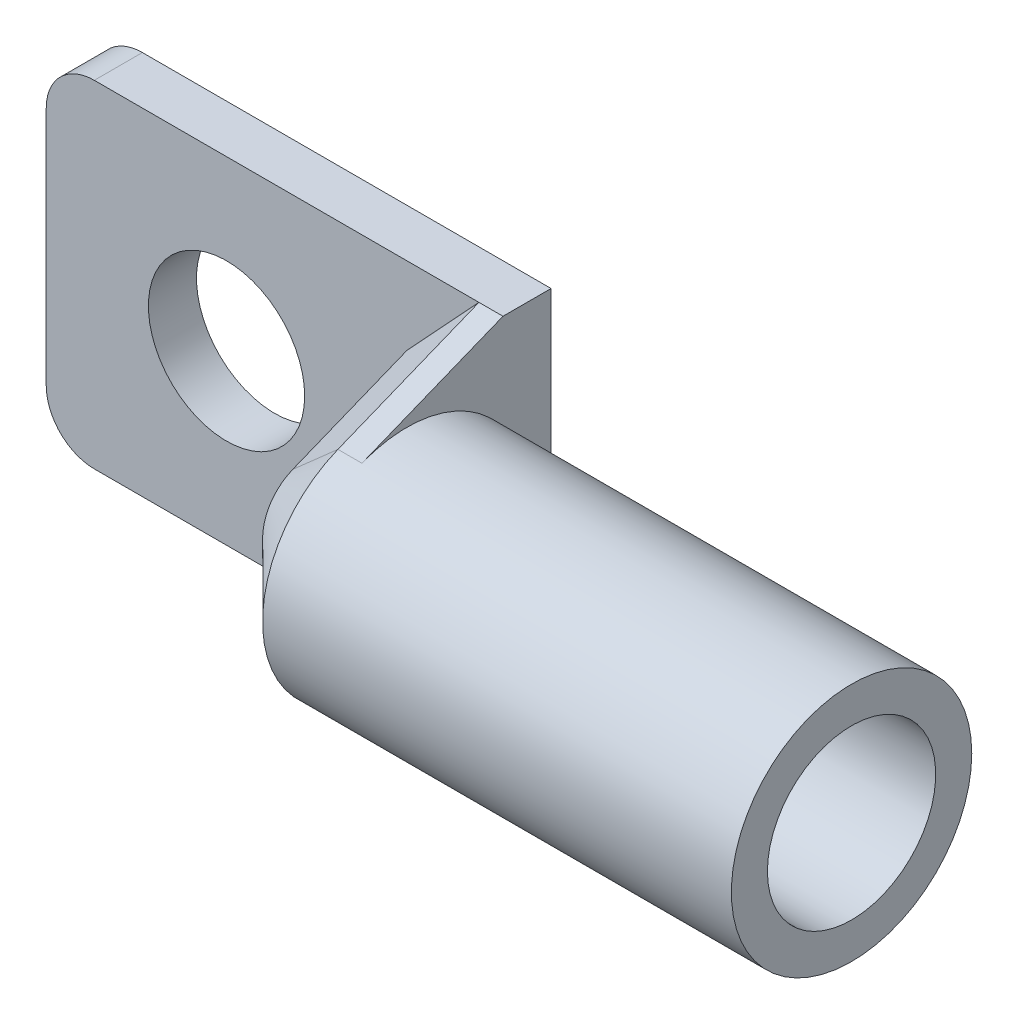
ISO-10303-21;
HEADER;
FILE_DESCRIPTION(('STEP AP214'),'2;1');
FILE_NAME('part.step','',(''),(''),'','','');
FILE_SCHEMA(('AUTOMOTIVE_DESIGN { 1 0 10303 214 1 1 1 1 }'));
ENDSEC;
DATA;
#1=APPLICATION_CONTEXT('core data for automotive mechanical design processes');
#2=APPLICATION_PROTOCOL_DEFINITION('international standard','automotive_design',2000,#1);
#3=PRODUCT_CONTEXT('',#1,'mechanical');
#4=PRODUCT('Part','Part','',(#3));
#5=PRODUCT_RELATED_PRODUCT_CATEGORY('part','',(#4));
#6=PRODUCT_DEFINITION_FORMATION('','',#4);
#7=PRODUCT_DEFINITION_CONTEXT('part definition',#1,'design');
#8=PRODUCT_DEFINITION('design','',#6,#7);
#9=PRODUCT_DEFINITION_SHAPE('','',#8);
#10=(LENGTH_UNIT() NAMED_UNIT(*) SI_UNIT(.MILLI.,.METRE.));
#11=(NAMED_UNIT(*) PLANE_ANGLE_UNIT() SI_UNIT($,.RADIAN.));
#12=(NAMED_UNIT(*) SI_UNIT($,.STERADIAN.) SOLID_ANGLE_UNIT());
#13=UNCERTAINTY_MEASURE_WITH_UNIT(LENGTH_MEASURE(1.E-05),#10,'distance_accuracy_value','');
#14=(GEOMETRIC_REPRESENTATION_CONTEXT(3) GLOBAL_UNCERTAINTY_ASSIGNED_CONTEXT((#13)) GLOBAL_UNIT_ASSIGNED_CONTEXT((#10,
#11,#12)) REPRESENTATION_CONTEXT('',''));
#15=CARTESIAN_POINT('',(0.,0.,0.));
#16=DIRECTION('',(0.,0.,1.));
#17=DIRECTION('',(1.,0.,0.));
#18=AXIS2_PLACEMENT_3D('',#15,#16,#17);
#19=CARTESIAN_POINT('',(0.,0.,2.));
#20=DIRECTION('',(0.,0.,1.));
#21=DIRECTION('',(1.,0.,0.));
#22=AXIS2_PLACEMENT_3D('',#19,#20,#21);
#23=PLANE('',#22);
#24=DIRECTION('',(0.,-1.,0.));
#25=VECTOR('',#24,1.);
#26=CARTESIAN_POINT('',(-7.5,7.,2.));
#27=LINE('',#26,#25);
#28=CARTESIAN_POINT('',(-7.5,5.,2.));
#29=VERTEX_POINT('',#28);
#30=CARTESIAN_POINT('',(-7.5,-5.,2.));
#31=VERTEX_POINT('',#30);
#32=EDGE_CURVE('E162',#29,#31,#27,.T.);
#33=ORIENTED_EDGE('',*,*,#32,.T.);
#34=CARTESIAN_POINT('',(-5.5,-5.,2.));
#35=DIRECTION('',(0.,0.,1.));
#36=DIRECTION('',(1.,0.,0.));
#37=AXIS2_PLACEMENT_3D('',#34,#35,#36);
#38=CIRCLE('',#37,2.);
#39=CARTESIAN_POINT('',(-5.5,-7.,2.));
#40=VERTEX_POINT('',#39);
#41=EDGE_CURVE('E43',#31,#40,#38,.T.);
#42=ORIENTED_EDGE('',*,*,#41,.T.);
#43=DIRECTION('',(1.,0.,0.));
#44=VECTOR('',#43,1.);
#45=CARTESIAN_POINT('',(-7.5,-7.,2.));
#46=LINE('',#45,#44);
#47=CARTESIAN_POINT('',(10.5,-7.,2.));
#48=VERTEX_POINT('',#47);
#49=EDGE_CURVE('E164',#40,#48,#46,.T.);
#50=ORIENTED_EDGE('',*,*,#49,.T.);
#51=DIRECTION('',(0.680094155203561,-0.733124777959356,0.));
#52=VECTOR('',#51,1.);
#53=CARTESIAN_POINT('',(10.5,-7.,2.));
#54=LINE('',#53,#52);
#55=CARTESIAN_POINT('',(7.5,-3.766073760449,2.));
#56=VERTEX_POINT('',#55);
#57=EDGE_CURVE('E192',#48,#56,#54,.F.);
#58=ORIENTED_EDGE('',*,*,#57,.T.);
#59=DIRECTION('',(0.,1.,0.));
#60=VECTOR('',#59,1.);
#61=CARTESIAN_POINT('',(7.5,7.,2.));
#62=LINE('',#61,#60);
#63=CARTESIAN_POINT('',(7.5,3.766073760449,2.));
#64=VERTEX_POINT('',#63);
#65=EDGE_CURVE('E167',#56,#64,#62,.T.);
#66=ORIENTED_EDGE('',*,*,#65,.T.);
#67=DIRECTION('',(-0.680094155203561,-0.733124777959356,0.));
#68=VECTOR('',#67,1.);
#69=CARTESIAN_POINT('',(9.32248316403477,5.73066580221966,2.));
#70=LINE('',#69,#68);
#71=CARTESIAN_POINT('',(10.5,7.,2.));
#72=VERTEX_POINT('',#71);
#73=EDGE_CURVE('E189',#64,#72,#70,.F.);
#74=ORIENTED_EDGE('',*,*,#73,.T.);
#75=DIRECTION('',(-1.,0.,0.));
#76=VECTOR('',#75,1.);
#77=CARTESIAN_POINT('',(-7.5,7.,2.));
#78=LINE('',#77,#76);
#79=CARTESIAN_POINT('',(-5.5,7.,2.));
#80=VERTEX_POINT('',#79);
#81=EDGE_CURVE('E170',#72,#80,#78,.T.);
#82=ORIENTED_EDGE('',*,*,#81,.T.);
#83=CARTESIAN_POINT('',(-5.5,5.,2.));
#84=DIRECTION('',(0.,0.,1.));
#85=DIRECTION('',(1.,0.,0.));
#86=AXIS2_PLACEMENT_3D('',#83,#84,#85);
#87=CIRCLE('',#86,2.);
#88=EDGE_CURVE('E211',#80,#29,#87,.T.);
#89=ORIENTED_EDGE('',*,*,#88,.T.);
#90=EDGE_LOOP('',(#33,#42,#50,#58,#66,#74,#82,#89));
#91=FACE_BOUND('',#90,.T.);
#92=CARTESIAN_POINT('',(0.,0.,2.));
#93=DIRECTION('',(0.,0.,1.));
#94=DIRECTION('',(1.,0.,0.));
#95=AXIS2_PLACEMENT_3D('',#92,#93,#94);
#96=CIRCLE('',#95,3.25);
#97=CARTESIAN_POINT('',(3.25,0.,2.));
#98=VERTEX_POINT('',#97);
#99=EDGE_CURVE('E156',#98,#98,#96,.T.);
#100=ORIENTED_EDGE('',*,*,#99,.F.);
#101=EDGE_LOOP('',(#100));
#102=FACE_BOUND('',#101,.T.);
#103=ADVANCED_FACE('F35',(#91,#102),#23,.T.);
#104=CARTESIAN_POINT('',(0.,0.,0.));
#105=DIRECTION('',(0.,0.,1.));
#106=DIRECTION('',(1.,0.,0.));
#107=AXIS2_PLACEMENT_3D('',#104,#105,#106);
#108=PLANE('',#107);
#109=DIRECTION('',(1.,0.,0.));
#110=VECTOR('',#109,1.);
#111=CARTESIAN_POINT('',(-7.5,-7.,0.));
#112=LINE('',#111,#110);
#113=CARTESIAN_POINT('',(-5.5,-7.,0.));
#114=VERTEX_POINT('',#113);
#115=CARTESIAN_POINT('',(11.5,-7.,0.));
#116=VERTEX_POINT('',#115);
#117=EDGE_CURVE('E174',#114,#116,#112,.T.);
#118=ORIENTED_EDGE('',*,*,#117,.F.);
#119=CARTESIAN_POINT('',(-5.5,-5.,0.));
#120=DIRECTION('',(0.,0.,1.));
#121=DIRECTION('',(1.,0.,0.));
#122=AXIS2_PLACEMENT_3D('',#119,#120,#121);
#123=CIRCLE('',#122,2.);
#124=CARTESIAN_POINT('',(-7.5,-5.,0.));
#125=VERTEX_POINT('',#124);
#126=EDGE_CURVE('E205',#114,#125,#123,.F.);
#127=ORIENTED_EDGE('',*,*,#126,.T.);
#128=DIRECTION('',(0.,-1.,0.));
#129=VECTOR('',#128,1.);
#130=CARTESIAN_POINT('',(-7.5,7.,0.));
#131=LINE('',#130,#129);
#132=CARTESIAN_POINT('',(-7.5,5.,0.));
#133=VERTEX_POINT('',#132);
#134=EDGE_CURVE('E159',#133,#125,#131,.T.);
#135=ORIENTED_EDGE('',*,*,#134,.F.);
#136=CARTESIAN_POINT('',(-5.5,5.,0.));
#137=DIRECTION('',(0.,0.,1.));
#138=DIRECTION('',(1.,0.,0.));
#139=AXIS2_PLACEMENT_3D('',#136,#137,#138);
#140=CIRCLE('',#139,2.);
#141=CARTESIAN_POINT('',(-5.5,7.,0.));
#142=VERTEX_POINT('',#141);
#143=EDGE_CURVE('E203',#133,#142,#140,.F.);
#144=ORIENTED_EDGE('',*,*,#143,.T.);
#145=DIRECTION('',(-1.,0.,0.));
#146=VECTOR('',#145,1.);
#147=CARTESIAN_POINT('',(-7.5,7.,0.));
#148=LINE('',#147,#146);
#149=CARTESIAN_POINT('',(11.5,7.,0.));
#150=VERTEX_POINT('',#149);
#151=EDGE_CURVE('E165',#150,#142,#148,.T.);
#152=ORIENTED_EDGE('',*,*,#151,.F.);
#153=DIRECTION('',(0.,1.,0.));
#154=VECTOR('',#153,1.);
#155=CARTESIAN_POINT('',(11.5,7.,0.));
#156=LINE('',#155,#154);
#157=EDGE_CURVE('E235',#116,#150,#156,.T.);
#158=ORIENTED_EDGE('',*,*,#157,.F.);
#159=EDGE_LOOP('',(#118,#127,#135,#144,#152,#158));
#160=FACE_BOUND('',#159,.T.);
#161=CARTESIAN_POINT('',(0.,0.,0.));
#162=DIRECTION('',(0.,0.,1.));
#163=DIRECTION('',(1.,0.,0.));
#164=AXIS2_PLACEMENT_3D('',#161,#162,#163);
#165=CIRCLE('',#164,3.25);
#166=CARTESIAN_POINT('',(3.25,0.,0.));
#167=VERTEX_POINT('',#166);
#168=EDGE_CURVE('E155',#167,#167,#165,.T.);
#169=ORIENTED_EDGE('',*,*,#168,.T.);
#170=EDGE_LOOP('',(#169));
#171=FACE_BOUND('',#170,.T.);
#172=ADVANCED_FACE('F227',(#160,#171),#108,.F.);
#173=CARTESIAN_POINT('',(-7.5,7.,2.));
#174=DIRECTION('',(1.,0.,0.));
#175=DIRECTION('',(0.,0.,-1.));
#176=AXIS2_PLACEMENT_3D('',#173,#174,#175);
#177=PLANE('',#176);
#178=ORIENTED_EDGE('',*,*,#134,.T.);
#179=DIRECTION('',(0.,0.,-1.));
#180=VECTOR('',#179,1.);
#181=CARTESIAN_POINT('',(-7.5,-5.,2.));
#182=LINE('',#181,#180);
#183=EDGE_CURVE('E56',#125,#31,#182,.F.);
#184=ORIENTED_EDGE('',*,*,#183,.T.);
#185=ORIENTED_EDGE('',*,*,#32,.F.);
#186=DIRECTION('',(0.,0.,-1.));
#187=VECTOR('',#186,1.);
#188=CARTESIAN_POINT('',(-7.5,5.,2.));
#189=LINE('',#188,#187);
#190=EDGE_CURVE('E207',#29,#133,#189,.T.);
#191=ORIENTED_EDGE('',*,*,#190,.T.);
#192=EDGE_LOOP('',(#178,#184,#185,#191));
#193=FACE_BOUND('',#192,.T.);
#194=ADVANCED_FACE('F230',(#193),#177,.F.);
#195=CARTESIAN_POINT('',(-7.5,-7.,2.));
#196=DIRECTION('',(0.,1.,0.));
#197=DIRECTION('',(0.,0.,1.));
#198=AXIS2_PLACEMENT_3D('',#195,#196,#197);
#199=PLANE('',#198);
#200=ORIENTED_EDGE('',*,*,#49,.F.);
#201=DIRECTION('',(0.,0.,-1.));
#202=VECTOR('',#201,1.);
#203=CARTESIAN_POINT('',(-5.5,-7.,2.));
#204=LINE('',#203,#202);
#205=EDGE_CURVE('E194',#40,#114,#204,.T.);
#206=ORIENTED_EDGE('',*,*,#205,.T.);
#207=ORIENTED_EDGE('',*,*,#117,.T.);
#208=DIRECTION('',(0.,0.,-1.));
#209=VECTOR('',#208,1.);
#210=CARTESIAN_POINT('',(11.5,-7.,0.));
#211=LINE('',#210,#209);
#212=CARTESIAN_POINT('',(11.5,-7.,2.));
#213=VERTEX_POINT('',#212);
#214=EDGE_CURVE('E236',#213,#116,#211,.T.);
#215=ORIENTED_EDGE('',*,*,#214,.F.);
#216=DIRECTION('',(-1.,0.,0.));
#217=VECTOR('',#216,1.);
#218=CARTESIAN_POINT('',(11.5,-7.,2.));
#219=LINE('',#218,#217);
#220=EDGE_CURVE('E148',#213,#48,#219,.T.);
#221=ORIENTED_EDGE('',*,*,#220,.T.);
#222=EDGE_LOOP('',(#200,#206,#207,#215,#221));
#223=FACE_BOUND('',#222,.T.);
#224=ADVANCED_FACE('F219',(#223),#199,.F.);
#225=CARTESIAN_POINT('',(-7.5,7.,2.));
#226=DIRECTION('',(0.,-1.,0.));
#227=DIRECTION('',(0.,0.,-1.));
#228=AXIS2_PLACEMENT_3D('',#225,#226,#227);
#229=PLANE('',#228);
#230=ORIENTED_EDGE('',*,*,#151,.T.);
#231=DIRECTION('',(0.,0.,-1.));
#232=VECTOR('',#231,1.);
#233=CARTESIAN_POINT('',(-5.5,7.,2.));
#234=LINE('',#233,#232);
#235=EDGE_CURVE('E11',#142,#80,#234,.F.);
#236=ORIENTED_EDGE('',*,*,#235,.T.);
#237=ORIENTED_EDGE('',*,*,#81,.F.);
#238=DIRECTION('',(-1.,0.,0.));
#239=VECTOR('',#238,1.);
#240=CARTESIAN_POINT('',(11.5,7.,2.));
#241=LINE('',#240,#239);
#242=CARTESIAN_POINT('',(11.5,7.,2.));
#243=VERTEX_POINT('',#242);
#244=EDGE_CURVE('E146',#243,#72,#241,.T.);
#245=ORIENTED_EDGE('',*,*,#244,.F.);
#246=DIRECTION('',(0.,0.,1.));
#247=VECTOR('',#246,1.);
#248=CARTESIAN_POINT('',(11.5,7.,2.));
#249=LINE('',#248,#247);
#250=EDGE_CURVE('E137',#150,#243,#249,.T.);
#251=ORIENTED_EDGE('',*,*,#250,.F.);
#252=EDGE_LOOP('',(#230,#236,#237,#245,#251));
#253=FACE_BOUND('',#252,.T.);
#254=ADVANCED_FACE('F234',(#253),#229,.F.);
#255=CARTESIAN_POINT('',(0.,0.,2.));
#256=DIRECTION('',(0.,0.,-1.));
#257=DIRECTION('',(-1.,0.,0.));
#258=AXIS2_PLACEMENT_3D('',#255,#256,#257);
#259=CYLINDRICAL_SURFACE('',#258,3.25);
#260=ORIENTED_EDGE('',*,*,#99,.T.);
#261=EDGE_LOOP('',(#260));
#262=FACE_BOUND('',#261,.T.);
#263=ORIENTED_EDGE('',*,*,#168,.F.);
#264=EDGE_LOOP('',(#263));
#265=FACE_BOUND('',#264,.T.);
#266=ADVANCED_FACE('F273',(#262,#265),#259,.F.);
#267=CARTESIAN_POINT('',(11.5,0.,6.));
#268=DIRECTION('',(-1.,0.,0.));
#269=DIRECTION('',(0.,0.,1.));
#270=AXIS2_PLACEMENT_3D('',#267,#268,#269);
#271=CYLINDRICAL_SURFACE('',#270,5.);
#272=DIRECTION('',(-1.,0.,0.));
#273=VECTOR('',#272,1.);
#274=CARTESIAN_POINT('',(11.5,4.63832471394977,7.8670682494121));
#275=LINE('',#274,#273);
#276=CARTESIAN_POINT('',(11.5,4.63832471394977,7.8670682494121));
#277=VERTEX_POINT('',#276);
#278=CARTESIAN_POINT('',(10.5,4.63832471394977,7.8670682494121));
#279=VERTEX_POINT('',#278);
#280=EDGE_CURVE('E124',#277,#279,#275,.T.);
#281=ORIENTED_EDGE('',*,*,#280,.T.);
#282=CARTESIAN_POINT('',(10.5,0.,6.));
#283=DIRECTION('',(1.,0.,0.));
#284=DIRECTION('',(0.,0.,-1.));
#285=AXIS2_PLACEMENT_3D('',#282,#283,#284);
#286=CIRCLE('',#285,5.);
#287=CARTESIAN_POINT('',(10.5,-4.63832471394977,7.8670682494121));
#288=VERTEX_POINT('',#287);
#289=EDGE_CURVE('E187',#279,#288,#286,.T.);
#290=ORIENTED_EDGE('',*,*,#289,.T.);
#291=DIRECTION('',(-1.,0.,0.));
#292=VECTOR('',#291,1.);
#293=CARTESIAN_POINT('',(11.5,-4.63832471394977,7.8670682494121));
#294=LINE('',#293,#292);
#295=CARTESIAN_POINT('',(11.5,-4.63832471394977,7.8670682494121));
#296=VERTEX_POINT('',#295);
#297=EDGE_CURVE('E126',#296,#288,#294,.T.);
#298=ORIENTED_EDGE('',*,*,#297,.F.);
#299=CARTESIAN_POINT('',(11.5,0.,6.));
#300=DIRECTION('',(1.,0.,0.));
#301=DIRECTION('',(0.,0.,-1.));
#302=AXIS2_PLACEMENT_3D('',#299,#300,#301);
#303=CIRCLE('',#302,5.);
#304=EDGE_CURVE('E119',#277,#296,#303,.F.);
#305=ORIENTED_EDGE('',*,*,#304,.F.);
#306=EDGE_LOOP('',(#281,#290,#298,#305));
#307=FACE_BOUND('',#306,.T.);
#308=CARTESIAN_POINT('',(30.,0.,6.));
#309=DIRECTION('',(1.,0.,0.));
#310=DIRECTION('',(0.,0.,-1.));
#311=AXIS2_PLACEMENT_3D('',#308,#309,#310);
#312=CIRCLE('',#311,5.);
#313=CARTESIAN_POINT('',(30.,0.,1.));
#314=VERTEX_POINT('',#313);
#315=EDGE_CURVE('E130',#314,#314,#312,.T.);
#316=ORIENTED_EDGE('',*,*,#315,.F.);
#317=EDGE_LOOP('',(#316));
#318=FACE_BOUND('',#317,.T.);
#319=ADVANCED_FACE('F121',(#307,#318),#271,.T.);
#320=CARTESIAN_POINT('',(11.5,-7.,2.));
#321=DIRECTION('',(0.,0.927664942789954,-0.37341364988242));
#322=DIRECTION('',(0.,0.37341364988242,0.927664942789954));
#323=AXIS2_PLACEMENT_3D('',#320,#321,#322);
#324=PLANE('',#323);
#325=ORIENTED_EDGE('',*,*,#297,.T.);
#326=DIRECTION('',(0.,-0.37341364988242,-0.927664942789954));
#327=VECTOR('',#326,1.);
#328=CARTESIAN_POINT('',(10.5,-7.,2.));
#329=LINE('',#328,#327);
#330=EDGE_CURVE('E184',#288,#48,#329,.T.);
#331=ORIENTED_EDGE('',*,*,#330,.T.);
#332=ORIENTED_EDGE('',*,*,#220,.F.);
#333=DIRECTION('',(0.,-0.37341364988242,-0.927664942789954));
#334=VECTOR('',#333,1.);
#335=CARTESIAN_POINT('',(11.5,-7.,2.));
#336=LINE('',#335,#334);
#337=EDGE_CURVE('E129',#296,#213,#336,.T.);
#338=ORIENTED_EDGE('',*,*,#337,.F.);
#339=EDGE_LOOP('',(#325,#331,#332,#338));
#340=FACE_BOUND('',#339,.T.);
#341=ADVANCED_FACE('F374',(#340),#324,.F.);
#342=CARTESIAN_POINT('',(11.5,4.63832471394977,7.8670682494121));
#343=DIRECTION('',(0.,-0.927664942789954,-0.37341364988242));
#344=DIRECTION('',(0.,0.37341364988242,-0.927664942789954));
#345=AXIS2_PLACEMENT_3D('',#342,#343,#344);
#346=PLANE('',#345);
#347=ORIENTED_EDGE('',*,*,#244,.T.);
#348=DIRECTION('',(0.,-0.37341364988242,0.927664942789954));
#349=VECTOR('',#348,1.);
#350=CARTESIAN_POINT('',(10.5,4.63832471394977,7.8670682494121));
#351=LINE('',#350,#349);
#352=EDGE_CURVE('E145',#72,#279,#351,.T.);
#353=ORIENTED_EDGE('',*,*,#352,.T.);
#354=ORIENTED_EDGE('',*,*,#280,.F.);
#355=DIRECTION('',(0.,-0.37341364988242,0.927664942789954));
#356=VECTOR('',#355,1.);
#357=CARTESIAN_POINT('',(11.5,4.63832471394977,7.8670682494121));
#358=LINE('',#357,#356);
#359=EDGE_CURVE('E133',#243,#277,#358,.T.);
#360=ORIENTED_EDGE('',*,*,#359,.F.);
#361=EDGE_LOOP('',(#347,#353,#354,#360));
#362=FACE_BOUND('',#361,.T.);
#363=ADVANCED_FACE('F143',(#362),#346,.F.);
#364=CARTESIAN_POINT('',(11.5,0.,6.));
#365=DIRECTION('',(1.,0.,0.));
#366=DIRECTION('',(0.,0.,-1.));
#367=AXIS2_PLACEMENT_3D('',#364,#365,#366);
#368=PLANE('',#367);
#369=ORIENTED_EDGE('',*,*,#359,.T.);
#370=ORIENTED_EDGE('',*,*,#304,.T.);
#371=ORIENTED_EDGE('',*,*,#337,.T.);
#372=ORIENTED_EDGE('',*,*,#214,.T.);
#373=ORIENTED_EDGE('',*,*,#157,.T.);
#374=ORIENTED_EDGE('',*,*,#250,.T.);
#375=EDGE_LOOP('',(#369,#370,#371,#372,#373,#374));
#376=FACE_BOUND('',#375,.T.);
#377=ADVANCED_FACE('F134',(#376),#368,.T.);
#378=CARTESIAN_POINT('',(7.5,0.,6.));
#379=DIRECTION('',(1.,0.,0.));
#380=DIRECTION('',(0.,0.,-1.));
#381=AXIS2_PLACEMENT_3D('',#378,#379,#380);
#382=PLANE('',#381);
#383=CARTESIAN_POINT('',(7.5,0.,6.));
#384=DIRECTION('',(1.,0.,0.));
#385=DIRECTION('',(0.,0.,-1.));
#386=AXIS2_PLACEMENT_3D('',#383,#384,#385);
#387=CIRCLE('',#386,1.99999999999999);
#388=CARTESIAN_POINT('',(7.5,-1.8553298855799,6.74682729976484));
#389=VERTEX_POINT('',#388);
#390=CARTESIAN_POINT('',(7.5,1.8553298855799,6.74682729976484));
#391=VERTEX_POINT('',#390);
#392=EDGE_CURVE('E178',#389,#391,#387,.F.);
#393=ORIENTED_EDGE('',*,*,#392,.T.);
#394=DIRECTION('',(0.,0.37341364988242,-0.927664942789954));
#395=VECTOR('',#394,1.);
#396=CARTESIAN_POINT('',(7.5,1.8553298855799,6.74682729976484));
#397=LINE('',#396,#395);
#398=EDGE_CURVE('E182',#391,#64,#397,.T.);
#399=ORIENTED_EDGE('',*,*,#398,.T.);
#400=ORIENTED_EDGE('',*,*,#65,.F.);
#401=DIRECTION('',(0.,0.37341364988242,0.927664942789954));
#402=VECTOR('',#401,1.);
#403=CARTESIAN_POINT('',(7.5,-1.8553298855799,6.74682729976484));
#404=LINE('',#403,#402);
#405=EDGE_CURVE('E180',#56,#389,#404,.T.);
#406=ORIENTED_EDGE('',*,*,#405,.T.);
#407=EDGE_LOOP('',(#393,#399,#400,#406));
#408=FACE_BOUND('',#407,.T.);
#409=ADVANCED_FACE('F253',(#408),#382,.F.);
#410=CARTESIAN_POINT('',(30.,0.,6.));
#411=DIRECTION('',(1.,0.,0.));
#412=DIRECTION('',(0.,0.,-1.));
#413=AXIS2_PLACEMENT_3D('',#410,#411,#412);
#414=PLANE('',#413);
#415=ORIENTED_EDGE('',*,*,#315,.T.);
#416=EDGE_LOOP('',(#415));
#417=FACE_BOUND('',#416,.T.);
#418=CARTESIAN_POINT('',(30.,0.,6.));
#419=DIRECTION('',(1.,0.,0.));
#420=DIRECTION('',(0.,0.,-1.));
#421=AXIS2_PLACEMENT_3D('',#418,#419,#420);
#422=CIRCLE('',#421,3.5);
#423=CARTESIAN_POINT('',(30.,0.,9.5));
#424=VERTEX_POINT('',#423);
#425=EDGE_CURVE('E200',#424,#424,#422,.T.);
#426=ORIENTED_EDGE('',*,*,#425,.F.);
#427=EDGE_LOOP('',(#426));
#428=FACE_BOUND('',#427,.T.);
#429=ADVANCED_FACE('F251',(#417,#428),#414,.T.);
#430=CARTESIAN_POINT('',(30.,0.,6.));
#431=DIRECTION('',(-1.,0.,0.));
#432=DIRECTION('',(0.,0.,1.));
#433=AXIS2_PLACEMENT_3D('',#430,#431,#432);
#434=CYLINDRICAL_SURFACE('',#433,3.5);
#435=CARTESIAN_POINT('',(11.5,0.,6.));
#436=DIRECTION('',(1.,0.,0.));
#437=DIRECTION('',(0.,0.,-1.));
#438=AXIS2_PLACEMENT_3D('',#435,#436,#437);
#439=CIRCLE('',#438,3.5);
#440=CARTESIAN_POINT('',(11.5,0.,9.5));
#441=VERTEX_POINT('',#440);
#442=EDGE_CURVE('E172',#441,#441,#439,.F.);
#443=CARTESIAN_POINT('',(11.5,0.,9.5));
#444=CARTESIAN_POINT('',(11.6927083333333,0.,9.5));
#445=CARTESIAN_POINT('',(11.8854166666667,0.,9.5));
#446=CARTESIAN_POINT('',(12.2708333333333,0.,9.5));
#447=CARTESIAN_POINT('',(12.4635416666667,0.,9.5));
#448=CARTESIAN_POINT('',(12.8489583333333,0.,9.5));
#449=CARTESIAN_POINT('',(13.0416666666667,0.,9.5));
#450=CARTESIAN_POINT('',(13.4270833333333,0.,9.5));
#451=CARTESIAN_POINT('',(13.6197916666667,0.,9.5));
#452=CARTESIAN_POINT('',(14.0052083333333,0.,9.5));
#453=CARTESIAN_POINT('',(14.1979166666667,0.,9.5));
#454=CARTESIAN_POINT('',(14.5833333333333,0.,9.5));
#455=CARTESIAN_POINT('',(14.7760416666667,0.,9.5));
#456=CARTESIAN_POINT('',(15.1614583333333,0.,9.5));
#457=CARTESIAN_POINT('',(15.3541666666667,0.,9.5));
#458=CARTESIAN_POINT('',(15.7395833333333,0.,9.5));
#459=CARTESIAN_POINT('',(15.9322916666667,0.,9.5));
#460=CARTESIAN_POINT('',(16.3177083333333,0.,9.5));
#461=CARTESIAN_POINT('',(16.5104166666667,0.,9.5));
#462=CARTESIAN_POINT('',(16.8958333333333,0.,9.5));
#463=CARTESIAN_POINT('',(17.0885416666667,0.,9.5));
#464=CARTESIAN_POINT('',(17.4739583333333,0.,9.5));
#465=CARTESIAN_POINT('',(17.6666666666667,0.,9.5));
#466=CARTESIAN_POINT('',(18.0520833333333,0.,9.5));
#467=CARTESIAN_POINT('',(18.2447916666667,0.,9.5));
#468=CARTESIAN_POINT('',(18.6302083333333,0.,9.5));
#469=CARTESIAN_POINT('',(18.8229166666667,0.,9.5));
#470=CARTESIAN_POINT('',(19.2083333333333,0.,9.5));
#471=CARTESIAN_POINT('',(19.4010416666667,0.,9.5));
#472=CARTESIAN_POINT('',(19.7864583333333,0.,9.5));
#473=CARTESIAN_POINT('',(19.9791666666667,0.,9.5));
#474=CARTESIAN_POINT('',(20.3645833333333,0.,9.5));
#475=CARTESIAN_POINT('',(20.5572916666667,0.,9.5));
#476=CARTESIAN_POINT('',(20.9427083333333,0.,9.5));
#477=CARTESIAN_POINT('',(21.1354166666667,0.,9.5));
#478=CARTESIAN_POINT('',(21.5208333333333,0.,9.5));
#479=CARTESIAN_POINT('',(21.7135416666667,0.,9.5));
#480=CARTESIAN_POINT('',(22.0989583333333,0.,9.5));
#481=CARTESIAN_POINT('',(22.2916666666667,0.,9.5));
#482=CARTESIAN_POINT('',(22.6770833333333,0.,9.5));
#483=CARTESIAN_POINT('',(22.8697916666667,0.,9.5));
#484=CARTESIAN_POINT('',(23.2552083333333,0.,9.5));
#485=CARTESIAN_POINT('',(23.4479166666667,0.,9.5));
#486=CARTESIAN_POINT('',(23.8333333333333,0.,9.5));
#487=CARTESIAN_POINT('',(24.0260416666667,0.,9.5));
#488=CARTESIAN_POINT('',(24.4114583333333,0.,9.5));
#489=CARTESIAN_POINT('',(24.6041666666667,0.,9.5));
#490=CARTESIAN_POINT('',(24.9895833333333,0.,9.5));
#491=CARTESIAN_POINT('',(25.1822916666667,0.,9.5));
#492=CARTESIAN_POINT('',(25.5677083333333,0.,9.5));
#493=CARTESIAN_POINT('',(25.7604166666667,0.,9.5));
#494=CARTESIAN_POINT('',(26.1458333333333,0.,9.5));
#495=CARTESIAN_POINT('',(26.3385416666667,0.,9.5));
#496=CARTESIAN_POINT('',(26.7239583333333,0.,9.5));
#497=CARTESIAN_POINT('',(26.9166666666667,0.,9.5));
#498=CARTESIAN_POINT('',(27.3020833333333,0.,9.5));
#499=CARTESIAN_POINT('',(27.4947916666667,0.,9.5));
#500=CARTESIAN_POINT('',(27.8802083333333,0.,9.5));
#501=CARTESIAN_POINT('',(28.0729166666667,0.,9.5));
#502=CARTESIAN_POINT('',(28.4583333333333,0.,9.5));
#503=CARTESIAN_POINT('',(28.6510416666667,0.,9.5));
#504=CARTESIAN_POINT('',(29.0364583333333,0.,9.5));
#505=CARTESIAN_POINT('',(29.2291666666667,0.,9.5));
#506=CARTESIAN_POINT('',(29.6145833333333,0.,9.5));
#507=CARTESIAN_POINT('',(29.8072916666667,0.,9.5));
#508=CARTESIAN_POINT('',(30.,0.,9.5));
#509=B_SPLINE_CURVE_WITH_KNOTS('',3,(#443,#444,#445,#446,#447,#448,#449,#450,#451,#452,#453,
#454,#455,#456,#457,#458,#459,#460,#461,#462,#463,#464,#465,#466,#467,#468,#469,#470,#471,#472,
#473,#474,#475,#476,#477,#478,#479,#480,#481,#482,#483,#484,#485,#486,#487,#488,#489,#490,#491,
#492,#493,#494,#495,#496,#497,#498,#499,#500,#501,#502,#503,#504,#505,#506,#507,#508),
.UNSPECIFIED.,.F.,.F.,(4,2,2,2,2,2,2,2,2,2,2,2,2,2,2,2,2,2,2,2,2,2,2,2,2,2,2,2,2,2,2,2,4),(0.,
0.578124999999999,1.15625,1.734375,2.3125,2.890625,3.46875,4.046875,4.625,5.203125,5.78125,
6.359375,6.9375,7.515625,8.09375,8.671875,9.25,9.828125,10.40625,10.984375,11.5625,12.140625,
12.71875,13.296875,13.875,14.453125,15.03125,15.609375,16.1875,16.765625,17.34375,17.921875,
18.5),.UNSPECIFIED.);
#510=EDGE_CURVE('BSEAM249',#441,#424,#509,.T.);
#511=ORIENTED_EDGE('',*,*,#442,.T.);
#512=ORIENTED_EDGE('',*,*,#425,.T.);
#513=ORIENTED_EDGE('',*,*,#510,.T.);
#514=ORIENTED_EDGE('',*,*,#510,.F.);
#515=EDGE_LOOP('',(#511,#513,#512,#514));
#516=FACE_BOUND('',#515,.T.);
#517=ADVANCED_FACE('F249',(#516),#434,.F.);
#518=ORIENTED_EDGE('',*,*,#442,.F.);
#519=EDGE_LOOP('',(#518));
#520=FACE_BOUND('',#519,.T.);
#521=ADVANCED_FACE('F260',(#520),#368,.T.);
#522=CARTESIAN_POINT('',(10.5,-7.,2.));
#523=DIRECTION('',(0.707106781186549,0.655958171715806,-0.264043324019478));
#524=DIRECTION('',(0.,-0.37341364988242,-0.927664942789954));
#525=AXIS2_PLACEMENT_3D('',#522,#523,#524);
#526=PLANE('',#525);
#527=ORIENTED_EDGE('',*,*,#57,.F.);
#528=ORIENTED_EDGE('',*,*,#330,.F.);
#529=DIRECTION('',(0.707106781186546,-0.655958171715809,0.264043324019479));
#530=VECTOR('',#529,1.);
#531=CARTESIAN_POINT('',(7.5,-1.8553298855799,6.74682729976484));
#532=LINE('',#531,#530);
#533=EDGE_CURVE('E197',#389,#288,#532,.T.);
#534=ORIENTED_EDGE('',*,*,#533,.F.);
#535=ORIENTED_EDGE('',*,*,#405,.F.);
#536=EDGE_LOOP('',(#527,#528,#534,#535));
#537=FACE_BOUND('',#536,.T.);
#538=ADVANCED_FACE('F289',(#537),#526,.F.);
#539=CARTESIAN_POINT('',(10.5,0.,6.));
#540=DIRECTION('',(1.,0.,0.));
#541=DIRECTION('',(0.,0.,-1.));
#542=AXIS2_PLACEMENT_3D('',#539,#540,#541);
#543=CONICAL_SURFACE('',#542,5.,0.78539816339745);
#544=ORIENTED_EDGE('',*,*,#533,.T.);
#545=ORIENTED_EDGE('',*,*,#289,.F.);
#546=DIRECTION('',(0.707106781186546,0.655958171715809,0.264043324019479));
#547=VECTOR('',#546,1.);
#548=CARTESIAN_POINT('',(7.5,1.8553298855799,6.74682729976484));
#549=LINE('',#548,#547);
#550=EDGE_CURVE('E195',#391,#279,#549,.T.);
#551=ORIENTED_EDGE('',*,*,#550,.F.);
#552=ORIENTED_EDGE('',*,*,#392,.F.);
#553=EDGE_LOOP('',(#544,#545,#551,#552));
#554=FACE_BOUND('',#553,.T.);
#555=ADVANCED_FACE('F285',(#554),#543,.T.);
#556=CARTESIAN_POINT('',(10.5,4.63832471394977,7.8670682494121));
#557=DIRECTION('',(0.707106781186549,-0.655958171715806,-0.264043324019478));
#558=DIRECTION('',(0.,-0.37341364988242,0.927664942789954));
#559=AXIS2_PLACEMENT_3D('',#556,#557,#558);
#560=PLANE('',#559);
#561=ORIENTED_EDGE('',*,*,#73,.F.);
#562=ORIENTED_EDGE('',*,*,#398,.F.);
#563=ORIENTED_EDGE('',*,*,#550,.T.);
#564=ORIENTED_EDGE('',*,*,#352,.F.);
#565=EDGE_LOOP('',(#561,#562,#563,#564));
#566=FACE_BOUND('',#565,.T.);
#567=ADVANCED_FACE('F282',(#566),#560,.F.);
#568=CARTESIAN_POINT('',(-5.5,-5.,2.));
#569=DIRECTION('',(0.,0.,-1.));
#570=DIRECTION('',(-1.,0.,0.));
#571=AXIS2_PLACEMENT_3D('',#568,#569,#570);
#572=CYLINDRICAL_SURFACE('',#571,2.);
#573=ORIENTED_EDGE('',*,*,#41,.F.);
#574=ORIENTED_EDGE('',*,*,#183,.F.);
#575=ORIENTED_EDGE('',*,*,#126,.F.);
#576=ORIENTED_EDGE('',*,*,#205,.F.);
#577=EDGE_LOOP('',(#573,#574,#575,#576));
#578=FACE_BOUND('',#577,.T.);
#579=ADVANCED_FACE('F224',(#578),#572,.T.);
#580=CARTESIAN_POINT('',(-5.5,5.,2.));
#581=DIRECTION('',(0.,0.,-1.));
#582=DIRECTION('',(-1.,0.,0.));
#583=AXIS2_PLACEMENT_3D('',#580,#581,#582);
#584=CYLINDRICAL_SURFACE('',#583,2.);
#585=ORIENTED_EDGE('',*,*,#88,.F.);
#586=ORIENTED_EDGE('',*,*,#235,.F.);
#587=ORIENTED_EDGE('',*,*,#143,.F.);
#588=ORIENTED_EDGE('',*,*,#190,.F.);
#589=EDGE_LOOP('',(#585,#586,#587,#588));
#590=FACE_BOUND('',#589,.T.);
#591=ADVANCED_FACE('F37',(#590),#584,.T.);
#592=CLOSED_SHELL('',(#103,#172,#194,#224,#254,#266,#319,#341,#363,#377,#409,#429,#517,#521,
#538,#555,#567,#579,#591));
#593=MANIFOLD_SOLID_BREP('B2',#592);
#594=ADVANCED_BREP_SHAPE_REPRESENTATION('',(#18,#593),#14);
#595=SHAPE_DEFINITION_REPRESENTATION(#9,#594);
ENDSEC;
END-ISO-10303-21;
